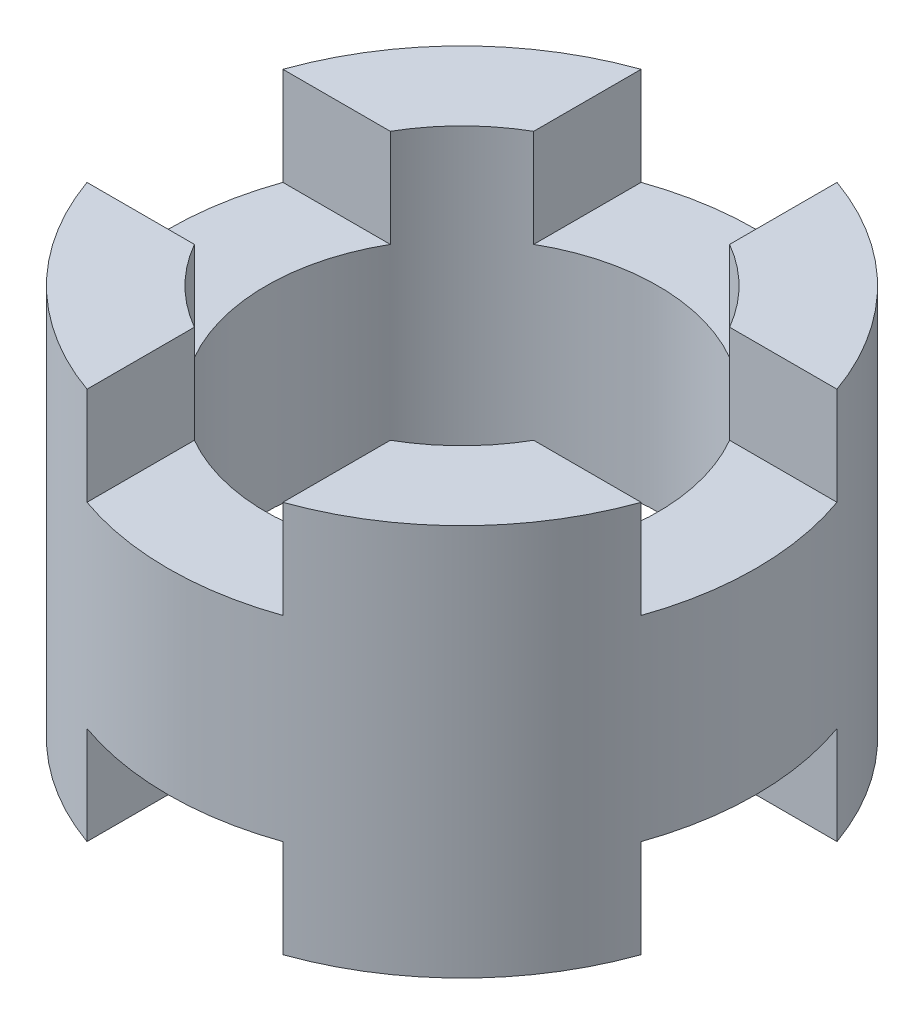
ISO-10303-21;
HEADER;
FILE_DESCRIPTION(('STEP AP214'),'2;1');
FILE_NAME('part.step','',(''),(''),'','','');
FILE_SCHEMA(('AUTOMOTIVE_DESIGN { 1 0 10303 214 1 1 1 1 }'));
ENDSEC;
DATA;
#1=APPLICATION_CONTEXT('core data for automotive mechanical design processes');
#2=APPLICATION_PROTOCOL_DEFINITION('international standard','automotive_design',2000,#1);
#3=PRODUCT_CONTEXT('',#1,'mechanical');
#4=PRODUCT('Part','Part','',(#3));
#5=PRODUCT_RELATED_PRODUCT_CATEGORY('part','',(#4));
#6=PRODUCT_DEFINITION_FORMATION('','',#4);
#7=PRODUCT_DEFINITION_CONTEXT('part definition',#1,'design');
#8=PRODUCT_DEFINITION('design','',#6,#7);
#9=PRODUCT_DEFINITION_SHAPE('','',#8);
#10=(LENGTH_UNIT() NAMED_UNIT(*) SI_UNIT(.MILLI.,.METRE.));
#11=(NAMED_UNIT(*) PLANE_ANGLE_UNIT() SI_UNIT($,.RADIAN.));
#12=(NAMED_UNIT(*) SI_UNIT($,.STERADIAN.) SOLID_ANGLE_UNIT());
#13=UNCERTAINTY_MEASURE_WITH_UNIT(LENGTH_MEASURE(1.E-05),#10,'distance_accuracy_value','');
#14=(GEOMETRIC_REPRESENTATION_CONTEXT(3) GLOBAL_UNCERTAINTY_ASSIGNED_CONTEXT((#13)) GLOBAL_UNIT_ASSIGNED_CONTEXT((#10,
#11,#12)) REPRESENTATION_CONTEXT('',''));
#15=CARTESIAN_POINT('',(0.,0.,0.));
#16=DIRECTION('',(0.,0.,1.));
#17=DIRECTION('',(1.,0.,0.));
#18=AXIS2_PLACEMENT_3D('',#15,#16,#17);
#19=CARTESIAN_POINT('',(0.,0.,0.));
#20=DIRECTION('',(0.,1.,0.));
#21=DIRECTION('',(0.,0.,1.));
#22=AXIS2_PLACEMENT_3D('',#19,#20,#21);
#23=PLANE('',#22);
#24=DIRECTION('',(0.,0.,-1.));
#25=VECTOR('',#24,1.);
#26=CARTESIAN_POINT('',(6.35000000000011,0.,39.1980233855296));
#27=LINE('',#26,#25);
#28=CARTESIAN_POINT('',(6.35000000000004,0.,17.9605122421383));
#29=VERTEX_POINT('',#28);
#30=CARTESIAN_POINT('',(6.35000000000002,0.,10.9985226280624));
#31=VERTEX_POINT('',#30);
#32=EDGE_CURVE('E269',#29,#31,#27,.T.);
#33=ORIENTED_EDGE('',*,*,#32,.T.);
#34=CARTESIAN_POINT('',(0.,0.,0.));
#35=DIRECTION('',(0.,1.,0.));
#36=DIRECTION('',(0.,0.,1.));
#37=AXIS2_PLACEMENT_3D('',#34,#35,#36);
#38=CIRCLE('',#37,12.7);
#39=CARTESIAN_POINT('',(10.9985226280624,0.,6.34999999999999));
#40=VERTEX_POINT('',#39);
#41=EDGE_CURVE('E489',#31,#40,#38,.T.);
#42=ORIENTED_EDGE('',*,*,#41,.T.);
#43=DIRECTION('',(1.,0.,0.));
#44=VECTOR('',#43,1.);
#45=CARTESIAN_POINT('',(-39.1980233855296,0.,6.34999999999998));
#46=LINE('',#45,#44);
#47=CARTESIAN_POINT('',(17.9605122421383,0.,6.34999999999999));
#48=VERTEX_POINT('',#47);
#49=EDGE_CURVE('E413',#40,#48,#46,.T.);
#50=ORIENTED_EDGE('',*,*,#49,.T.);
#51=CARTESIAN_POINT('',(0.,0.,0.));
#52=DIRECTION('',(0.,1.,0.));
#53=DIRECTION('',(0.,0.,1.));
#54=AXIS2_PLACEMENT_3D('',#51,#52,#53);
#55=CIRCLE('',#54,19.05);
#56=EDGE_CURVE('E276',#29,#48,#55,.T.);
#57=ORIENTED_EDGE('',*,*,#56,.F.);
#58=EDGE_LOOP('',(#33,#42,#50,#57));
#59=FACE_BOUND('',#58,.T.);
#60=ADVANCED_FACE('F41',(#59),#23,.F.);
#61=CARTESIAN_POINT('',(0.,25.4,0.));
#62=DIRECTION('',(0.,-1.,0.));
#63=DIRECTION('',(0.,0.,-1.));
#64=AXIS2_PLACEMENT_3D('',#61,#62,#63);
#65=CYLINDRICAL_SURFACE('',#64,19.05);
#66=CARTESIAN_POINT('',(0.,19.05,0.));
#67=DIRECTION('',(0.,-1.,0.));
#68=DIRECTION('',(0.,0.,-1.));
#69=AXIS2_PLACEMENT_3D('',#66,#67,#68);
#70=CIRCLE('',#69,19.05);
#71=CARTESIAN_POINT('',(6.35000000000007,19.05,17.9605122421383));
#72=VERTEX_POINT('',#71);
#73=CARTESIAN_POINT('',(-6.34999999999993,19.05,17.9605122421383));
#74=VERTEX_POINT('',#73);
#75=EDGE_CURVE('E448',#72,#74,#70,.T.);
#76=ORIENTED_EDGE('',*,*,#75,.T.);
#77=DIRECTION('',(0.,-1.,0.));
#78=VECTOR('',#77,1.);
#79=CARTESIAN_POINT('',(-6.34999999999993,25.4,17.9605122421383));
#80=LINE('',#79,#78);
#81=CARTESIAN_POINT('',(-6.34999999999993,25.4,17.9605122421383));
#82=VERTEX_POINT('',#81);
#83=EDGE_CURVE('E455',#74,#82,#80,.F.);
#84=ORIENTED_EDGE('',*,*,#83,.T.);
#85=CARTESIAN_POINT('',(0.,25.4,0.));
#86=DIRECTION('',(0.,1.,0.));
#87=DIRECTION('',(0.,0.,1.));
#88=AXIS2_PLACEMENT_3D('',#85,#86,#87);
#89=CIRCLE('',#88,19.05);
#90=CARTESIAN_POINT('',(-17.9605122421383,25.4,6.35000000000001));
#91=VERTEX_POINT('',#90);
#92=EDGE_CURVE('E287',#91,#82,#89,.T.);
#93=ORIENTED_EDGE('',*,*,#92,.F.);
#94=DIRECTION('',(0.,-1.,0.));
#95=VECTOR('',#94,1.);
#96=CARTESIAN_POINT('',(-17.9605122421383,25.4,6.35000000000001));
#97=LINE('',#96,#95);
#98=CARTESIAN_POINT('',(-17.9605122421383,19.05,6.35000000000001));
#99=VERTEX_POINT('',#98);
#100=EDGE_CURVE('E480',#91,#99,#97,.T.);
#101=ORIENTED_EDGE('',*,*,#100,.T.);
#102=CARTESIAN_POINT('',(0.,19.05,0.));
#103=DIRECTION('',(0.,-1.,0.));
#104=DIRECTION('',(0.,0.,-1.));
#105=AXIS2_PLACEMENT_3D('',#102,#103,#104);
#106=CIRCLE('',#105,19.05);
#107=CARTESIAN_POINT('',(-17.9605122421383,19.05,-6.34999999999999));
#108=VERTEX_POINT('',#107);
#109=EDGE_CURVE('E473',#99,#108,#106,.T.);
#110=ORIENTED_EDGE('',*,*,#109,.T.);
#111=DIRECTION('',(0.,-1.,0.));
#112=VECTOR('',#111,1.);
#113=CARTESIAN_POINT('',(-17.9605122421383,25.4,-6.34999999999999));
#114=LINE('',#113,#112);
#115=CARTESIAN_POINT('',(-17.9605122421383,25.4,-6.34999999999999));
#116=VERTEX_POINT('',#115);
#117=EDGE_CURVE('E483',#108,#116,#114,.F.);
#118=ORIENTED_EDGE('',*,*,#117,.T.);
#119=CARTESIAN_POINT('',(-6.35000000000006,25.4,-17.9605122421383));
#120=VERTEX_POINT('',#119);
#121=EDGE_CURVE('E288',#120,#116,#89,.T.);
#122=ORIENTED_EDGE('',*,*,#121,.F.);
#123=DIRECTION('',(0.,-1.,0.));
#124=VECTOR('',#123,1.);
#125=CARTESIAN_POINT('',(-6.35000000000006,25.4,-17.9605122421383));
#126=LINE('',#125,#124);
#127=CARTESIAN_POINT('',(-6.35000000000006,19.05,-17.9605122421383));
#128=VERTEX_POINT('',#127);
#129=EDGE_CURVE('E458',#120,#128,#126,.T.);
#130=ORIENTED_EDGE('',*,*,#129,.T.);
#131=CARTESIAN_POINT('',(6.34999999999994,19.05,-17.9605122421383));
#132=VERTEX_POINT('',#131);
#133=EDGE_CURVE('E445',#128,#132,#70,.T.);
#134=ORIENTED_EDGE('',*,*,#133,.T.);
#135=DIRECTION('',(0.,-1.,0.));
#136=VECTOR('',#135,1.);
#137=CARTESIAN_POINT('',(6.34999999999994,25.4,-17.9605122421383));
#138=LINE('',#137,#136);
#139=CARTESIAN_POINT('',(6.34999999999994,25.4,-17.9605122421383));
#140=VERTEX_POINT('',#139);
#141=EDGE_CURVE('E449',#132,#140,#138,.F.);
#142=ORIENTED_EDGE('',*,*,#141,.T.);
#143=CARTESIAN_POINT('',(17.9605122421383,25.4,-6.35));
#144=VERTEX_POINT('',#143);
#145=EDGE_CURVE('E295',#144,#140,#89,.T.);
#146=ORIENTED_EDGE('',*,*,#145,.F.);
#147=DIRECTION('',(0.,-1.,0.));
#148=VECTOR('',#147,1.);
#149=CARTESIAN_POINT('',(17.9605122421383,25.4,-6.35));
#150=LINE('',#149,#148);
#151=CARTESIAN_POINT('',(17.9605122421383,19.05,-6.35));
#152=VERTEX_POINT('',#151);
#153=EDGE_CURVE('E486',#144,#152,#150,.T.);
#154=ORIENTED_EDGE('',*,*,#153,.T.);
#155=CARTESIAN_POINT('',(17.9605122421383,19.05,6.35));
#156=VERTEX_POINT('',#155);
#157=EDGE_CURVE('E476',#152,#156,#106,.T.);
#158=ORIENTED_EDGE('',*,*,#157,.T.);
#159=DIRECTION('',(0.,-1.,0.));
#160=VECTOR('',#159,1.);
#161=CARTESIAN_POINT('',(17.9605122421383,25.4,6.35));
#162=LINE('',#161,#160);
#163=CARTESIAN_POINT('',(17.9605122421383,25.4,6.35));
#164=VERTEX_POINT('',#163);
#165=EDGE_CURVE('E477',#156,#164,#162,.F.);
#166=ORIENTED_EDGE('',*,*,#165,.T.);
#167=CARTESIAN_POINT('',(6.35000000000007,25.4,17.9605122421383));
#168=VERTEX_POINT('',#167);
#169=EDGE_CURVE('E283',#168,#164,#89,.T.);
#170=ORIENTED_EDGE('',*,*,#169,.F.);
#171=DIRECTION('',(0.,-1.,0.));
#172=VECTOR('',#171,1.);
#173=CARTESIAN_POINT('',(6.35000000000007,25.4,17.9605122421383));
#174=LINE('',#173,#172);
#175=EDGE_CURVE('E452',#168,#72,#174,.T.);
#176=ORIENTED_EDGE('',*,*,#175,.T.);
#177=EDGE_LOOP('',(#76,#84,#93,#101,#110,#118,#122,#130,#134,#142,#146,#154,#158,#166,#170,#176));
#178=FACE_BOUND('',#177,.T.);
#179=DIRECTION('',(0.,-1.,0.));
#180=VECTOR('',#179,1.);
#181=CARTESIAN_POINT('',(6.35000000000004,25.4,17.9605122421383));
#182=LINE('',#181,#180);
#183=CARTESIAN_POINT('',(6.35000000000004,6.35,17.9605122421383));
#184=VERTEX_POINT('',#183);
#185=EDGE_CURVE('E397',#29,#184,#182,.F.);
#186=ORIENTED_EDGE('',*,*,#185,.F.);
#187=ORIENTED_EDGE('',*,*,#56,.T.);
#188=DIRECTION('',(0.,-1.,0.));
#189=VECTOR('',#188,1.);
#190=CARTESIAN_POINT('',(17.9605122421383,25.4,6.34999999999999));
#191=LINE('',#190,#189);
#192=CARTESIAN_POINT('',(17.9605122421383,6.35,6.34999999999999));
#193=VERTEX_POINT('',#192);
#194=EDGE_CURVE('E428',#193,#48,#191,.T.);
#195=ORIENTED_EDGE('',*,*,#194,.F.);
#196=CARTESIAN_POINT('',(0.,6.35,0.));
#197=DIRECTION('',(0.,-1.,0.));
#198=DIRECTION('',(0.,0.,-1.));
#199=AXIS2_PLACEMENT_3D('',#196,#197,#198);
#200=CIRCLE('',#199,19.05);
#201=CARTESIAN_POINT('',(17.9605122421383,6.35,-6.35000000000001));
#202=VERTEX_POINT('',#201);
#203=EDGE_CURVE('E421',#202,#193,#200,.T.);
#204=ORIENTED_EDGE('',*,*,#203,.F.);
#205=DIRECTION('',(0.,-1.,0.));
#206=VECTOR('',#205,1.);
#207=CARTESIAN_POINT('',(17.9605122421383,25.4,-6.35000000000001));
#208=LINE('',#207,#206);
#209=CARTESIAN_POINT('',(17.9605122421383,0.,-6.35000000000001));
#210=VERTEX_POINT('',#209);
#211=EDGE_CURVE('E425',#202,#210,#208,.T.);
#212=ORIENTED_EDGE('',*,*,#211,.T.);
#213=CARTESIAN_POINT('',(6.34999999999993,0.,-17.9605122421383));
#214=VERTEX_POINT('',#213);
#215=EDGE_CURVE('E278',#210,#214,#55,.T.);
#216=ORIENTED_EDGE('',*,*,#215,.T.);
#217=DIRECTION('',(0.,-1.,0.));
#218=VECTOR('',#217,1.);
#219=CARTESIAN_POINT('',(6.34999999999993,25.4,-17.9605122421383));
#220=LINE('',#219,#218);
#221=CARTESIAN_POINT('',(6.34999999999993,6.35,-17.9605122421383));
#222=VERTEX_POINT('',#221);
#223=EDGE_CURVE('E399',#222,#214,#220,.T.);
#224=ORIENTED_EDGE('',*,*,#223,.F.);
#225=CARTESIAN_POINT('',(0.,6.35,0.));
#226=DIRECTION('',(0.,-1.,0.));
#227=DIRECTION('',(0.,0.,-1.));
#228=AXIS2_PLACEMENT_3D('',#225,#226,#227);
#229=CIRCLE('',#228,19.05);
#230=CARTESIAN_POINT('',(-6.35000000000007,6.35,-17.9605122421383));
#231=VERTEX_POINT('',#230);
#232=EDGE_CURVE('E401',#231,#222,#229,.T.);
#233=ORIENTED_EDGE('',*,*,#232,.F.);
#234=DIRECTION('',(0.,-1.,0.));
#235=VECTOR('',#234,1.);
#236=CARTESIAN_POINT('',(-6.35000000000007,25.4,-17.9605122421383));
#237=LINE('',#236,#235);
#238=CARTESIAN_POINT('',(-6.35000000000007,0.,-17.9605122421383));
#239=VERTEX_POINT('',#238);
#240=EDGE_CURVE('E258',#231,#239,#237,.T.);
#241=ORIENTED_EDGE('',*,*,#240,.T.);
#242=CARTESIAN_POINT('',(-17.9605122421383,0.,-6.35000000000002));
#243=VERTEX_POINT('',#242);
#244=EDGE_CURVE('E275',#239,#243,#55,.T.);
#245=ORIENTED_EDGE('',*,*,#244,.T.);
#246=DIRECTION('',(0.,-1.,0.));
#247=VECTOR('',#246,1.);
#248=CARTESIAN_POINT('',(-17.9605122421383,25.4,-6.35000000000002));
#249=LINE('',#248,#247);
#250=CARTESIAN_POINT('',(-17.9605122421383,6.35,-6.35000000000002));
#251=VERTEX_POINT('',#250);
#252=EDGE_CURVE('E422',#243,#251,#249,.F.);
#253=ORIENTED_EDGE('',*,*,#252,.T.);
#254=CARTESIAN_POINT('',(-17.9605122421383,6.35,6.34999999999998));
#255=VERTEX_POINT('',#254);
#256=EDGE_CURVE('E419',#255,#251,#200,.T.);
#257=ORIENTED_EDGE('',*,*,#256,.F.);
#258=DIRECTION('',(0.,-1.,0.));
#259=VECTOR('',#258,1.);
#260=CARTESIAN_POINT('',(-17.9605122421383,25.4,6.34999999999998));
#261=LINE('',#260,#259);
#262=CARTESIAN_POINT('',(-17.9605122421383,0.,6.34999999999998));
#263=VERTEX_POINT('',#262);
#264=EDGE_CURVE('E274',#263,#255,#261,.F.);
#265=ORIENTED_EDGE('',*,*,#264,.F.);
#266=CARTESIAN_POINT('',(-6.34999999999995,0.,17.9605122421383));
#267=VERTEX_POINT('',#266);
#268=EDGE_CURVE('E265',#263,#267,#55,.T.);
#269=ORIENTED_EDGE('',*,*,#268,.T.);
#270=DIRECTION('',(0.,-1.,0.));
#271=VECTOR('',#270,1.);
#272=CARTESIAN_POINT('',(-6.34999999999995,25.4,17.9605122421383));
#273=LINE('',#272,#271);
#274=CARTESIAN_POINT('',(-6.34999999999995,6.35,17.9605122421383));
#275=VERTEX_POINT('',#274);
#276=EDGE_CURVE('E250',#267,#275,#273,.F.);
#277=ORIENTED_EDGE('',*,*,#276,.T.);
#278=EDGE_CURVE('E403',#184,#275,#229,.T.);
#279=ORIENTED_EDGE('',*,*,#278,.F.);
#280=EDGE_LOOP('',(#186,#187,#195,#204,#212,#216,#224,#233,#241,#245,#253,#257,#265,#269,#277,#279));
#281=FACE_BOUND('',#280,.T.);
#282=ADVANCED_FACE('F43',(#178,#281),#65,.T.);
#283=CARTESIAN_POINT('',(0.,25.4,0.));
#284=DIRECTION('',(0.,-1.,0.));
#285=DIRECTION('',(0.,0.,-1.));
#286=AXIS2_PLACEMENT_3D('',#283,#284,#285);
#287=CYLINDRICAL_SURFACE('',#286,12.7);
#288=DIRECTION('',(0.,-1.,0.));
#289=VECTOR('',#288,1.);
#290=CARTESIAN_POINT('',(-6.34999999999995,25.4,10.9985226280624));
#291=LINE('',#290,#289);
#292=CARTESIAN_POINT('',(-6.34999999999995,19.05,10.9985226280624));
#293=VERTEX_POINT('',#292);
#294=CARTESIAN_POINT('',(-6.34999999999995,25.4,10.9985226280624));
#295=VERTEX_POINT('',#294);
#296=EDGE_CURVE('E343',#293,#295,#291,.F.);
#297=ORIENTED_EDGE('',*,*,#296,.F.);
#298=CARTESIAN_POINT('',(0.,19.05,0.));
#299=DIRECTION('',(0.,-1.,0.));
#300=DIRECTION('',(0.,0.,-1.));
#301=AXIS2_PLACEMENT_3D('',#298,#299,#300);
#302=CIRCLE('',#301,12.7);
#303=CARTESIAN_POINT('',(6.35000000000005,19.05,10.9985226280623));
#304=VERTEX_POINT('',#303);
#305=EDGE_CURVE('E335',#304,#293,#302,.T.);
#306=ORIENTED_EDGE('',*,*,#305,.F.);
#307=DIRECTION('',(0.,-1.,0.));
#308=VECTOR('',#307,1.);
#309=CARTESIAN_POINT('',(6.35000000000005,25.4,10.9985226280623));
#310=LINE('',#309,#308);
#311=CARTESIAN_POINT('',(6.35000000000005,25.4,10.9985226280623));
#312=VERTEX_POINT('',#311);
#313=EDGE_CURVE('E340',#312,#304,#310,.T.);
#314=ORIENTED_EDGE('',*,*,#313,.F.);
#315=CARTESIAN_POINT('',(0.,25.4,0.));
#316=DIRECTION('',(0.,1.,0.));
#317=DIRECTION('',(0.,0.,1.));
#318=AXIS2_PLACEMENT_3D('',#315,#316,#317);
#319=CIRCLE('',#318,12.7);
#320=CARTESIAN_POINT('',(10.9985226280624,25.4,6.35));
#321=VERTEX_POINT('',#320);
#322=EDGE_CURVE('E493',#312,#321,#319,.T.);
#323=ORIENTED_EDGE('',*,*,#322,.T.);
#324=DIRECTION('',(0.,-1.,0.));
#325=VECTOR('',#324,1.);
#326=CARTESIAN_POINT('',(10.9985226280624,25.4,6.35));
#327=LINE('',#326,#325);
#328=CARTESIAN_POINT('',(10.9985226280624,19.05,6.35));
#329=VERTEX_POINT('',#328);
#330=EDGE_CURVE('E317',#329,#321,#327,.F.);
#331=ORIENTED_EDGE('',*,*,#330,.F.);
#332=CARTESIAN_POINT('',(0.,19.05,0.));
#333=DIRECTION('',(0.,-1.,0.));
#334=DIRECTION('',(0.,0.,-1.));
#335=AXIS2_PLACEMENT_3D('',#332,#333,#334);
#336=CIRCLE('',#335,12.7);
#337=CARTESIAN_POINT('',(10.9985226280624,19.05,-6.35));
#338=VERTEX_POINT('',#337);
#339=EDGE_CURVE('E309',#338,#329,#336,.T.);
#340=ORIENTED_EDGE('',*,*,#339,.F.);
#341=DIRECTION('',(0.,-1.,0.));
#342=VECTOR('',#341,1.);
#343=CARTESIAN_POINT('',(10.9985226280624,25.4,-6.35));
#344=LINE('',#343,#342);
#345=CARTESIAN_POINT('',(10.9985226280624,25.4,-6.35));
#346=VERTEX_POINT('',#345);
#347=EDGE_CURVE('E323',#346,#338,#344,.T.);
#348=ORIENTED_EDGE('',*,*,#347,.F.);
#349=CARTESIAN_POINT('',(6.34999999999996,25.4,-10.9985226280624));
#350=VERTEX_POINT('',#349);
#351=EDGE_CURVE('E279',#346,#350,#319,.T.);
#352=ORIENTED_EDGE('',*,*,#351,.T.);
#353=DIRECTION('',(0.,-1.,0.));
#354=VECTOR('',#353,1.);
#355=CARTESIAN_POINT('',(6.34999999999996,25.4,-10.9985226280624));
#356=LINE('',#355,#354);
#357=CARTESIAN_POINT('',(6.34999999999996,19.05,-10.9985226280624));
#358=VERTEX_POINT('',#357);
#359=EDGE_CURVE('E334',#358,#350,#356,.F.);
#360=ORIENTED_EDGE('',*,*,#359,.F.);
#361=CARTESIAN_POINT('',(-6.35000000000004,19.05,-10.9985226280624));
#362=VERTEX_POINT('',#361);
#363=EDGE_CURVE('E332',#362,#358,#302,.T.);
#364=ORIENTED_EDGE('',*,*,#363,.F.);
#365=DIRECTION('',(0.,-1.,0.));
#366=VECTOR('',#365,1.);
#367=CARTESIAN_POINT('',(-6.35000000000004,25.4,-10.9985226280624));
#368=LINE('',#367,#366);
#369=CARTESIAN_POINT('',(-6.35000000000004,25.4,-10.9985226280624));
#370=VERTEX_POINT('',#369);
#371=EDGE_CURVE('E337',#370,#362,#368,.T.);
#372=ORIENTED_EDGE('',*,*,#371,.F.);
#373=CARTESIAN_POINT('',(-10.9985226280624,25.4,-6.34999999999999));
#374=VERTEX_POINT('',#373);
#375=EDGE_CURVE('E492',#370,#374,#319,.T.);
#376=ORIENTED_EDGE('',*,*,#375,.T.);
#377=DIRECTION('',(0.,-1.,0.));
#378=VECTOR('',#377,1.);
#379=CARTESIAN_POINT('',(-10.9985226280624,25.4,-6.34999999999999));
#380=LINE('',#379,#378);
#381=CARTESIAN_POINT('',(-10.9985226280624,19.05,-6.34999999999999));
#382=VERTEX_POINT('',#381);
#383=EDGE_CURVE('E315',#382,#374,#380,.F.);
#384=ORIENTED_EDGE('',*,*,#383,.F.);
#385=CARTESIAN_POINT('',(-10.9985226280624,19.05,6.35000000000001));
#386=VERTEX_POINT('',#385);
#387=EDGE_CURVE('E303',#386,#382,#336,.T.);
#388=ORIENTED_EDGE('',*,*,#387,.F.);
#389=DIRECTION('',(0.,-1.,0.));
#390=VECTOR('',#389,1.);
#391=CARTESIAN_POINT('',(-10.9985226280624,25.4,6.35000000000001));
#392=LINE('',#391,#390);
#393=CARTESIAN_POINT('',(-10.9985226280624,25.4,6.35000000000001));
#394=VERTEX_POINT('',#393);
#395=EDGE_CURVE('E308',#394,#386,#392,.T.);
#396=ORIENTED_EDGE('',*,*,#395,.F.);
#397=EDGE_CURVE('E490',#394,#295,#319,.T.);
#398=ORIENTED_EDGE('',*,*,#397,.T.);
#399=EDGE_LOOP('',(#297,#306,#314,#323,#331,#340,#348,#352,#360,#364,#372,#376,#384,#388,#396,#398));
#400=FACE_BOUND('',#399,.T.);
#401=ORIENTED_EDGE('',*,*,#41,.F.);
#402=DIRECTION('',(0.,-1.,0.));
#403=VECTOR('',#402,1.);
#404=CARTESIAN_POINT('',(6.35000000000002,25.4,10.9985226280624));
#405=LINE('',#404,#403);
#406=CARTESIAN_POINT('',(6.35000000000002,6.35,10.9985226280624));
#407=VERTEX_POINT('',#406);
#408=EDGE_CURVE('E393',#31,#407,#405,.F.);
#409=ORIENTED_EDGE('',*,*,#408,.T.);
#410=CARTESIAN_POINT('',(0.,6.35,0.));
#411=DIRECTION('',(0.,-1.,0.));
#412=DIRECTION('',(0.,0.,-1.));
#413=AXIS2_PLACEMENT_3D('',#410,#411,#412);
#414=CIRCLE('',#413,12.7);
#415=CARTESIAN_POINT('',(-6.34999999999998,6.35,10.9985226280624));
#416=VERTEX_POINT('',#415);
#417=EDGE_CURVE('E12',#407,#416,#414,.T.);
#418=ORIENTED_EDGE('',*,*,#417,.T.);
#419=DIRECTION('',(0.,-1.,0.));
#420=VECTOR('',#419,1.);
#421=CARTESIAN_POINT('',(-6.34999999999998,25.4,10.9985226280624));
#422=LINE('',#421,#420);
#423=CARTESIAN_POINT('',(-6.34999999999998,0.,10.9985226280624));
#424=VERTEX_POINT('',#423);
#425=EDGE_CURVE('E384',#424,#416,#422,.F.);
#426=ORIENTED_EDGE('',*,*,#425,.F.);
#427=CARTESIAN_POINT('',(-10.9985226280624,0.,6.34999999999998));
#428=VERTEX_POINT('',#427);
#429=EDGE_CURVE('E267',#428,#424,#38,.T.);
#430=ORIENTED_EDGE('',*,*,#429,.F.);
#431=DIRECTION('',(0.,-1.,0.));
#432=VECTOR('',#431,1.);
#433=CARTESIAN_POINT('',(-10.9985226280624,25.4,6.34999999999998));
#434=LINE('',#433,#432);
#435=CARTESIAN_POINT('',(-10.9985226280624,6.35,6.34999999999998));
#436=VERTEX_POINT('',#435);
#437=EDGE_CURVE('E352',#428,#436,#434,.F.);
#438=ORIENTED_EDGE('',*,*,#437,.T.);
#439=CARTESIAN_POINT('',(0.,6.35,0.));
#440=DIRECTION('',(0.,-1.,0.));
#441=DIRECTION('',(0.,0.,-1.));
#442=AXIS2_PLACEMENT_3D('',#439,#440,#441);
#443=CIRCLE('',#442,12.7);
#444=CARTESIAN_POINT('',(-10.9985226280624,6.35,-6.35000000000002));
#445=VERTEX_POINT('',#444);
#446=EDGE_CURVE('E345',#436,#445,#443,.T.);
#447=ORIENTED_EDGE('',*,*,#446,.T.);
#448=DIRECTION('',(0.,-1.,0.));
#449=VECTOR('',#448,1.);
#450=CARTESIAN_POINT('',(-10.9985226280624,25.4,-6.35000000000002));
#451=LINE('',#450,#449);
#452=CARTESIAN_POINT('',(-10.9985226280624,0.,-6.35000000000002));
#453=VERTEX_POINT('',#452);
#454=EDGE_CURVE('E348',#453,#445,#451,.F.);
#455=ORIENTED_EDGE('',*,*,#454,.F.);
#456=CARTESIAN_POINT('',(-6.35000000000005,0.,-10.9985226280623));
#457=VERTEX_POINT('',#456);
#458=EDGE_CURVE('E494',#457,#453,#38,.T.);
#459=ORIENTED_EDGE('',*,*,#458,.F.);
#460=DIRECTION('',(0.,-1.,0.));
#461=VECTOR('',#460,1.);
#462=CARTESIAN_POINT('',(-6.35000000000005,25.4,-10.9985226280623));
#463=LINE('',#462,#461);
#464=CARTESIAN_POINT('',(-6.35000000000005,6.35,-10.9985226280623));
#465=VERTEX_POINT('',#464);
#466=EDGE_CURVE('E64',#465,#457,#463,.T.);
#467=ORIENTED_EDGE('',*,*,#466,.F.);
#468=CARTESIAN_POINT('',(6.34999999999995,6.35,-10.9985226280624));
#469=VERTEX_POINT('',#468);
#470=EDGE_CURVE('E45',#465,#469,#414,.T.);
#471=ORIENTED_EDGE('',*,*,#470,.T.);
#472=DIRECTION('',(0.,-1.,0.));
#473=VECTOR('',#472,1.);
#474=CARTESIAN_POINT('',(6.34999999999995,25.4,-10.9985226280624));
#475=LINE('',#474,#473);
#476=CARTESIAN_POINT('',(6.34999999999995,0.,-10.9985226280624));
#477=VERTEX_POINT('',#476);
#478=EDGE_CURVE('E370',#469,#477,#475,.T.);
#479=ORIENTED_EDGE('',*,*,#478,.T.);
#480=CARTESIAN_POINT('',(10.9985226280624,0.,-6.35000000000001));
#481=VERTEX_POINT('',#480);
#482=EDGE_CURVE('E495',#481,#477,#38,.T.);
#483=ORIENTED_EDGE('',*,*,#482,.F.);
#484=DIRECTION('',(0.,-1.,0.));
#485=VECTOR('',#484,1.);
#486=CARTESIAN_POINT('',(10.9985226280624,25.4,-6.35000000000001));
#487=LINE('',#486,#485);
#488=CARTESIAN_POINT('',(10.9985226280624,6.35,-6.35000000000001));
#489=VERTEX_POINT('',#488);
#490=EDGE_CURVE('E355',#489,#481,#487,.T.);
#491=ORIENTED_EDGE('',*,*,#490,.F.);
#492=CARTESIAN_POINT('',(10.9985226280624,6.35,6.34999999999999));
#493=VERTEX_POINT('',#492);
#494=EDGE_CURVE('E349',#489,#493,#443,.T.);
#495=ORIENTED_EDGE('',*,*,#494,.T.);
#496=DIRECTION('',(0.,-1.,0.));
#497=VECTOR('',#496,1.);
#498=CARTESIAN_POINT('',(10.9985226280624,25.4,6.34999999999999));
#499=LINE('',#498,#497);
#500=EDGE_CURVE('E357',#493,#40,#499,.T.);
#501=ORIENTED_EDGE('',*,*,#500,.T.);
#502=EDGE_LOOP('',(#401,#409,#418,#426,#430,#438,#447,#455,#459,#467,#471,#479,#483,#491,#495,#501));
#503=FACE_BOUND('',#502,.T.);
#504=ADVANCED_FACE('F368',(#400,#503),#287,.F.);
#505=DIRECTION('',(0.,0.,1.));
#506=VECTOR('',#505,1.);
#507=CARTESIAN_POINT('',(6.34999999999999,0.,0.));
#508=LINE('',#507,#506);
#509=EDGE_CURVE('E361',#214,#477,#508,.T.);
#510=ORIENTED_EDGE('',*,*,#509,.F.);
#511=ORIENTED_EDGE('',*,*,#215,.F.);
#512=DIRECTION('',(1.,0.,0.));
#513=VECTOR('',#512,1.);
#514=CARTESIAN_POINT('',(-39.1980233855296,0.,-6.35000000000002));
#515=LINE('',#514,#513);
#516=EDGE_CURVE('E417',#481,#210,#515,.T.);
#517=ORIENTED_EDGE('',*,*,#516,.F.);
#518=ORIENTED_EDGE('',*,*,#482,.T.);
#519=EDGE_LOOP('',(#510,#511,#517,#518));
#520=FACE_BOUND('',#519,.T.);
#521=ADVANCED_FACE('F561',(#520),#23,.F.);
#522=ORIENTED_EDGE('',*,*,#429,.T.);
#523=DIRECTION('',(0.,0.,-1.));
#524=VECTOR('',#523,1.);
#525=CARTESIAN_POINT('',(-6.34999999999989,0.,39.1980233855296));
#526=LINE('',#525,#524);
#527=EDGE_CURVE('E253',#267,#424,#526,.T.);
#528=ORIENTED_EDGE('',*,*,#527,.F.);
#529=ORIENTED_EDGE('',*,*,#268,.F.);
#530=EDGE_CURVE('E416',#263,#428,#46,.T.);
#531=ORIENTED_EDGE('',*,*,#530,.T.);
#532=EDGE_LOOP('',(#522,#528,#529,#531));
#533=FACE_BOUND('',#532,.T.);
#534=ADVANCED_FACE('F263',(#533),#23,.F.);
#535=CARTESIAN_POINT('',(0.,25.4,0.));
#536=DIRECTION('',(0.,1.,0.));
#537=DIRECTION('',(0.,0.,1.));
#538=AXIS2_PLACEMENT_3D('',#535,#536,#537);
#539=PLANE('',#538);
#540=DIRECTION('',(0.,0.,1.));
#541=VECTOR('',#540,1.);
#542=CARTESIAN_POINT('',(-6.35000000000013,25.4,-38.0999999999997));
#543=LINE('',#542,#541);
#544=EDGE_CURVE('E436',#120,#370,#543,.T.);
#545=ORIENTED_EDGE('',*,*,#544,.F.);
#546=ORIENTED_EDGE('',*,*,#121,.T.);
#547=DIRECTION('',(-1.,0.,0.));
#548=VECTOR('',#547,1.);
#549=CARTESIAN_POINT('',(38.0999999999997,25.4,-6.35));
#550=LINE('',#549,#548);
#551=EDGE_CURVE('E471',#374,#116,#550,.T.);
#552=ORIENTED_EDGE('',*,*,#551,.F.);
#553=ORIENTED_EDGE('',*,*,#375,.F.);
#554=EDGE_LOOP('',(#545,#546,#552,#553));
#555=FACE_BOUND('',#554,.T.);
#556=ADVANCED_FACE('F521',(#555),#539,.T.);
#557=EDGE_CURVE('E443',#295,#82,#543,.T.);
#558=ORIENTED_EDGE('',*,*,#557,.F.);
#559=ORIENTED_EDGE('',*,*,#397,.F.);
#560=DIRECTION('',(1.,0.,0.));
#561=VECTOR('',#560,1.);
#562=CARTESIAN_POINT('',(38.0999999999997,25.4,6.35));
#563=LINE('',#562,#561);
#564=EDGE_CURVE('E470',#91,#394,#563,.T.);
#565=ORIENTED_EDGE('',*,*,#564,.F.);
#566=ORIENTED_EDGE('',*,*,#92,.T.);
#567=EDGE_LOOP('',(#558,#559,#565,#566));
#568=FACE_BOUND('',#567,.T.);
#569=ADVANCED_FACE('F533',(#568),#539,.T.);
#570=DIRECTION('',(0.,0.,-1.));
#571=VECTOR('',#570,1.);
#572=CARTESIAN_POINT('',(6.34999999999987,25.4,-38.0999999999998));
#573=LINE('',#572,#571);
#574=EDGE_CURVE('E431',#350,#140,#573,.T.);
#575=ORIENTED_EDGE('',*,*,#574,.F.);
#576=ORIENTED_EDGE('',*,*,#351,.F.);
#577=EDGE_CURVE('E465',#144,#346,#550,.T.);
#578=ORIENTED_EDGE('',*,*,#577,.F.);
#579=ORIENTED_EDGE('',*,*,#145,.T.);
#580=EDGE_LOOP('',(#575,#576,#578,#579));
#581=FACE_BOUND('',#580,.T.);
#582=ADVANCED_FACE('F510',(#581),#539,.T.);
#583=EDGE_CURVE('E442',#168,#312,#573,.T.);
#584=ORIENTED_EDGE('',*,*,#583,.F.);
#585=ORIENTED_EDGE('',*,*,#169,.T.);
#586=EDGE_CURVE('E461',#321,#164,#563,.T.);
#587=ORIENTED_EDGE('',*,*,#586,.F.);
#588=ORIENTED_EDGE('',*,*,#322,.F.);
#589=EDGE_LOOP('',(#584,#585,#587,#588));
#590=FACE_BOUND('',#589,.T.);
#591=ADVANCED_FACE('F543',(#590),#539,.T.);
#592=ORIENTED_EDGE('',*,*,#244,.F.);
#593=DIRECTION('',(0.,0.,1.));
#594=VECTOR('',#593,1.);
#595=CARTESIAN_POINT('',(-6.35000000000001,0.,0.));
#596=LINE('',#595,#594);
#597=EDGE_CURVE('E360',#239,#457,#596,.T.);
#598=ORIENTED_EDGE('',*,*,#597,.T.);
#599=ORIENTED_EDGE('',*,*,#458,.T.);
#600=EDGE_CURVE('E408',#243,#453,#515,.T.);
#601=ORIENTED_EDGE('',*,*,#600,.F.);
#602=EDGE_LOOP('',(#592,#598,#599,#601));
#603=FACE_BOUND('',#602,.T.);
#604=ADVANCED_FACE('F562',(#603),#23,.F.);
#605=CARTESIAN_POINT('',(0.,19.05,0.));
#606=DIRECTION('',(0.,-1.,0.));
#607=DIRECTION('',(0.,0.,-1.));
#608=AXIS2_PLACEMENT_3D('',#605,#606,#607);
#609=PLANE('',#608);
#610=DIRECTION('',(1.,0.,0.));
#611=VECTOR('',#610,1.);
#612=CARTESIAN_POINT('',(38.0999999999997,19.05,6.35));
#613=LINE('',#612,#611);
#614=EDGE_CURVE('E464',#99,#386,#613,.T.);
#615=ORIENTED_EDGE('',*,*,#614,.T.);
#616=ORIENTED_EDGE('',*,*,#387,.T.);
#617=DIRECTION('',(-1.,0.,0.));
#618=VECTOR('',#617,1.);
#619=CARTESIAN_POINT('',(38.0999999999997,19.05,-6.35));
#620=LINE('',#619,#618);
#621=EDGE_CURVE('E466',#382,#108,#620,.T.);
#622=ORIENTED_EDGE('',*,*,#621,.T.);
#623=ORIENTED_EDGE('',*,*,#109,.F.);
#624=EDGE_LOOP('',(#615,#616,#622,#623));
#625=FACE_BOUND('',#624,.T.);
#626=ADVANCED_FACE('F525',(#625),#609,.F.);
#627=CARTESIAN_POINT('',(38.0999999999997,19.05,6.35));
#628=DIRECTION('',(0.,0.,1.));
#629=DIRECTION('',(1.,0.,0.));
#630=AXIS2_PLACEMENT_3D('',#627,#628,#629);
#631=PLANE('',#630);
#632=ORIENTED_EDGE('',*,*,#564,.T.);
#633=ORIENTED_EDGE('',*,*,#395,.T.);
#634=ORIENTED_EDGE('',*,*,#614,.F.);
#635=ORIENTED_EDGE('',*,*,#100,.F.);
#636=EDGE_LOOP('',(#632,#633,#634,#635));
#637=FACE_BOUND('',#636,.T.);
#638=ADVANCED_FACE('F527',(#637),#631,.F.);
#639=CARTESIAN_POINT('',(38.0999999999997,19.05,-6.35));
#640=DIRECTION('',(0.,0.,-1.));
#641=DIRECTION('',(-1.,0.,0.));
#642=AXIS2_PLACEMENT_3D('',#639,#640,#641);
#643=PLANE('',#642);
#644=ORIENTED_EDGE('',*,*,#621,.F.);
#645=ORIENTED_EDGE('',*,*,#383,.T.);
#646=ORIENTED_EDGE('',*,*,#551,.T.);
#647=ORIENTED_EDGE('',*,*,#117,.F.);
#648=EDGE_LOOP('',(#644,#645,#646,#647));
#649=FACE_BOUND('',#648,.T.);
#650=ADVANCED_FACE('F522',(#649),#643,.F.);
#651=ORIENTED_EDGE('',*,*,#577,.T.);
#652=ORIENTED_EDGE('',*,*,#347,.T.);
#653=EDGE_CURVE('E468',#152,#338,#620,.T.);
#654=ORIENTED_EDGE('',*,*,#653,.F.);
#655=ORIENTED_EDGE('',*,*,#153,.F.);
#656=EDGE_LOOP('',(#651,#652,#654,#655));
#657=FACE_BOUND('',#656,.T.);
#658=ADVANCED_FACE('F550',(#657),#643,.F.);
#659=EDGE_CURVE('E462',#329,#156,#613,.T.);
#660=ORIENTED_EDGE('',*,*,#659,.F.);
#661=ORIENTED_EDGE('',*,*,#330,.T.);
#662=ORIENTED_EDGE('',*,*,#586,.T.);
#663=ORIENTED_EDGE('',*,*,#165,.F.);
#664=EDGE_LOOP('',(#660,#661,#662,#663));
#665=FACE_BOUND('',#664,.T.);
#666=ADVANCED_FACE('F545',(#665),#631,.F.);
#667=ORIENTED_EDGE('',*,*,#653,.T.);
#668=ORIENTED_EDGE('',*,*,#339,.T.);
#669=ORIENTED_EDGE('',*,*,#659,.T.);
#670=ORIENTED_EDGE('',*,*,#157,.F.);
#671=EDGE_LOOP('',(#667,#668,#669,#670));
#672=FACE_BOUND('',#671,.T.);
#673=ADVANCED_FACE('F548',(#672),#609,.F.);
#674=CARTESIAN_POINT('',(0.,19.05,0.));
#675=DIRECTION('',(0.,-1.,0.));
#676=DIRECTION('',(-1.,0.,0.));
#677=AXIS2_PLACEMENT_3D('',#674,#675,#676);
#678=PLANE('',#677);
#679=DIRECTION('',(0.,0.,1.));
#680=VECTOR('',#679,1.);
#681=CARTESIAN_POINT('',(-6.35000000000013,19.05,-38.0999999999997));
#682=LINE('',#681,#680);
#683=EDGE_CURVE('E440',#128,#362,#682,.T.);
#684=ORIENTED_EDGE('',*,*,#683,.T.);
#685=ORIENTED_EDGE('',*,*,#363,.T.);
#686=DIRECTION('',(0.,0.,-1.));
#687=VECTOR('',#686,1.);
#688=CARTESIAN_POINT('',(6.34999999999987,19.05,-38.0999999999998));
#689=LINE('',#688,#687);
#690=EDGE_CURVE('E432',#358,#132,#689,.T.);
#691=ORIENTED_EDGE('',*,*,#690,.T.);
#692=ORIENTED_EDGE('',*,*,#133,.F.);
#693=EDGE_LOOP('',(#684,#685,#691,#692));
#694=FACE_BOUND('',#693,.T.);
#695=ADVANCED_FACE('F518',(#694),#678,.F.);
#696=CARTESIAN_POINT('',(6.34999999999987,19.05,-38.0999999999998));
#697=DIRECTION('',(1.,0.,0.));
#698=DIRECTION('',(0.,0.,-1.));
#699=AXIS2_PLACEMENT_3D('',#696,#697,#698);
#700=PLANE('',#699);
#701=ORIENTED_EDGE('',*,*,#690,.F.);
#702=ORIENTED_EDGE('',*,*,#359,.T.);
#703=ORIENTED_EDGE('',*,*,#574,.T.);
#704=ORIENTED_EDGE('',*,*,#141,.F.);
#705=EDGE_LOOP('',(#701,#702,#703,#704));
#706=FACE_BOUND('',#705,.T.);
#707=ADVANCED_FACE('F513',(#706),#700,.F.);
#708=CARTESIAN_POINT('',(-6.35000000000013,19.05,-38.0999999999997));
#709=DIRECTION('',(-1.,0.,0.));
#710=DIRECTION('',(0.,0.,1.));
#711=AXIS2_PLACEMENT_3D('',#708,#709,#710);
#712=PLANE('',#711);
#713=ORIENTED_EDGE('',*,*,#544,.T.);
#714=ORIENTED_EDGE('',*,*,#371,.T.);
#715=ORIENTED_EDGE('',*,*,#683,.F.);
#716=ORIENTED_EDGE('',*,*,#129,.F.);
#717=EDGE_LOOP('',(#713,#714,#715,#716));
#718=FACE_BOUND('',#717,.T.);
#719=ADVANCED_FACE('F520',(#718),#712,.F.);
#720=EDGE_CURVE('E437',#293,#74,#682,.T.);
#721=ORIENTED_EDGE('',*,*,#720,.F.);
#722=ORIENTED_EDGE('',*,*,#296,.T.);
#723=ORIENTED_EDGE('',*,*,#557,.T.);
#724=ORIENTED_EDGE('',*,*,#83,.F.);
#725=EDGE_LOOP('',(#721,#722,#723,#724));
#726=FACE_BOUND('',#725,.T.);
#727=ADVANCED_FACE('F536',(#726),#712,.F.);
#728=ORIENTED_EDGE('',*,*,#583,.T.);
#729=ORIENTED_EDGE('',*,*,#313,.T.);
#730=EDGE_CURVE('E435',#72,#304,#689,.T.);
#731=ORIENTED_EDGE('',*,*,#730,.F.);
#732=ORIENTED_EDGE('',*,*,#175,.F.);
#733=EDGE_LOOP('',(#728,#729,#731,#732));
#734=FACE_BOUND('',#733,.T.);
#735=ADVANCED_FACE('F541',(#734),#700,.F.);
#736=ORIENTED_EDGE('',*,*,#730,.T.);
#737=ORIENTED_EDGE('',*,*,#305,.T.);
#738=ORIENTED_EDGE('',*,*,#720,.T.);
#739=ORIENTED_EDGE('',*,*,#75,.F.);
#740=EDGE_LOOP('',(#736,#737,#738,#739));
#741=FACE_BOUND('',#740,.T.);
#742=ADVANCED_FACE('F539',(#741),#678,.F.);
#743=CARTESIAN_POINT('',(0.,6.35,0.));
#744=DIRECTION('',(0.,-1.,0.));
#745=DIRECTION('',(0.,0.,-1.));
#746=AXIS2_PLACEMENT_3D('',#743,#744,#745);
#747=PLANE('',#746);
#748=ORIENTED_EDGE('',*,*,#256,.T.);
#749=DIRECTION('',(1.,0.,0.));
#750=VECTOR('',#749,1.);
#751=CARTESIAN_POINT('',(-39.1980233855296,6.35,-6.35000000000002));
#752=LINE('',#751,#750);
#753=EDGE_CURVE('E412',#251,#445,#752,.T.);
#754=ORIENTED_EDGE('',*,*,#753,.T.);
#755=ORIENTED_EDGE('',*,*,#446,.F.);
#756=DIRECTION('',(1.,0.,0.));
#757=VECTOR('',#756,1.);
#758=CARTESIAN_POINT('',(-39.1980233855296,6.35,6.34999999999998));
#759=LINE('',#758,#757);
#760=EDGE_CURVE('E407',#255,#436,#759,.T.);
#761=ORIENTED_EDGE('',*,*,#760,.F.);
#762=EDGE_LOOP('',(#748,#754,#755,#761));
#763=FACE_BOUND('',#762,.T.);
#764=ADVANCED_FACE('F682',(#763),#747,.T.);
#765=CARTESIAN_POINT('',(-39.1980233855296,6.35,-6.35000000000002));
#766=DIRECTION('',(0.,0.,-1.));
#767=DIRECTION('',(-1.,0.,0.));
#768=AXIS2_PLACEMENT_3D('',#765,#766,#767);
#769=PLANE('',#768);
#770=ORIENTED_EDGE('',*,*,#600,.T.);
#771=ORIENTED_EDGE('',*,*,#454,.T.);
#772=ORIENTED_EDGE('',*,*,#753,.F.);
#773=ORIENTED_EDGE('',*,*,#252,.F.);
#774=EDGE_LOOP('',(#770,#771,#772,#773));
#775=FACE_BOUND('',#774,.T.);
#776=ADVANCED_FACE('F691',(#775),#769,.F.);
#777=CARTESIAN_POINT('',(-39.1980233855296,6.35,6.34999999999998));
#778=DIRECTION('',(0.,0.,-1.));
#779=DIRECTION('',(-1.,0.,0.));
#780=AXIS2_PLACEMENT_3D('',#777,#778,#779);
#781=PLANE('',#780);
#782=ORIENTED_EDGE('',*,*,#264,.T.);
#783=ORIENTED_EDGE('',*,*,#760,.T.);
#784=ORIENTED_EDGE('',*,*,#437,.F.);
#785=ORIENTED_EDGE('',*,*,#530,.F.);
#786=EDGE_LOOP('',(#782,#783,#784,#785));
#787=FACE_BOUND('',#786,.T.);
#788=ADVANCED_FACE('F702',(#787),#781,.T.);
#789=ORIENTED_EDGE('',*,*,#194,.T.);
#790=ORIENTED_EDGE('',*,*,#49,.F.);
#791=ORIENTED_EDGE('',*,*,#500,.F.);
#792=EDGE_CURVE('E404',#493,#193,#759,.T.);
#793=ORIENTED_EDGE('',*,*,#792,.T.);
#794=EDGE_LOOP('',(#789,#790,#791,#793));
#795=FACE_BOUND('',#794,.T.);
#796=ADVANCED_FACE('F713',(#795),#781,.T.);
#797=EDGE_CURVE('E409',#489,#202,#752,.T.);
#798=ORIENTED_EDGE('',*,*,#797,.F.);
#799=ORIENTED_EDGE('',*,*,#490,.T.);
#800=ORIENTED_EDGE('',*,*,#516,.T.);
#801=ORIENTED_EDGE('',*,*,#211,.F.);
#802=EDGE_LOOP('',(#798,#799,#800,#801));
#803=FACE_BOUND('',#802,.T.);
#804=ADVANCED_FACE('F705',(#803),#769,.F.);
#805=ORIENTED_EDGE('',*,*,#203,.T.);
#806=ORIENTED_EDGE('',*,*,#792,.F.);
#807=ORIENTED_EDGE('',*,*,#494,.F.);
#808=ORIENTED_EDGE('',*,*,#797,.T.);
#809=EDGE_LOOP('',(#805,#806,#807,#808));
#810=FACE_BOUND('',#809,.T.);
#811=ADVANCED_FACE('F694',(#810),#747,.T.);
#812=CARTESIAN_POINT('',(6.35000000000011,6.35,39.1980233855296));
#813=DIRECTION('',(-1.,0.,0.));
#814=DIRECTION('',(0.,0.,1.));
#815=AXIS2_PLACEMENT_3D('',#812,#813,#814);
#816=PLANE('',#815);
#817=ORIENTED_EDGE('',*,*,#223,.T.);
#818=ORIENTED_EDGE('',*,*,#509,.T.);
#819=ORIENTED_EDGE('',*,*,#478,.F.);
#820=DIRECTION('',(0.,0.,-1.));
#821=VECTOR('',#820,1.);
#822=CARTESIAN_POINT('',(6.35000000000011,6.35,39.1980233855296));
#823=LINE('',#822,#821);
#824=EDGE_CURVE('E268',#469,#222,#823,.T.);
#825=ORIENTED_EDGE('',*,*,#824,.T.);
#826=EDGE_LOOP('',(#817,#818,#819,#825));
#827=FACE_BOUND('',#826,.T.);
#828=ADVANCED_FACE('F738',(#827),#816,.T.);
#829=CARTESIAN_POINT('',(-6.34999999999989,6.35,39.1980233855296));
#830=DIRECTION('',(-1.,0.,0.));
#831=DIRECTION('',(0.,0.,1.));
#832=AXIS2_PLACEMENT_3D('',#829,#830,#831);
#833=PLANE('',#832);
#834=DIRECTION('',(0.,0.,-1.));
#835=VECTOR('',#834,1.);
#836=CARTESIAN_POINT('',(-6.34999999999989,6.35,39.1980233855296));
#837=LINE('',#836,#835);
#838=EDGE_CURVE('E377',#465,#231,#837,.T.);
#839=ORIENTED_EDGE('',*,*,#838,.F.);
#840=ORIENTED_EDGE('',*,*,#466,.T.);
#841=ORIENTED_EDGE('',*,*,#597,.F.);
#842=ORIENTED_EDGE('',*,*,#240,.F.);
#843=EDGE_LOOP('',(#839,#840,#841,#842));
#844=FACE_BOUND('',#843,.T.);
#845=ADVANCED_FACE('F380',(#844),#833,.F.);
#846=CARTESIAN_POINT('',(0.,6.35,0.));
#847=DIRECTION('',(0.,-1.,0.));
#848=DIRECTION('',(-1.,0.,0.));
#849=AXIS2_PLACEMENT_3D('',#846,#847,#848);
#850=PLANE('',#849);
#851=ORIENTED_EDGE('',*,*,#232,.T.);
#852=ORIENTED_EDGE('',*,*,#824,.F.);
#853=ORIENTED_EDGE('',*,*,#470,.F.);
#854=ORIENTED_EDGE('',*,*,#838,.T.);
#855=EDGE_LOOP('',(#851,#852,#853,#854));
#856=FACE_BOUND('',#855,.T.);
#857=ADVANCED_FACE('F376',(#856),#850,.T.);
#858=ORIENTED_EDGE('',*,*,#278,.T.);
#859=EDGE_CURVE('E56',#275,#416,#837,.T.);
#860=ORIENTED_EDGE('',*,*,#859,.T.);
#861=ORIENTED_EDGE('',*,*,#417,.F.);
#862=EDGE_CURVE('E382',#184,#407,#823,.T.);
#863=ORIENTED_EDGE('',*,*,#862,.F.);
#864=EDGE_LOOP('',(#858,#860,#861,#863));
#865=FACE_BOUND('',#864,.T.);
#866=ADVANCED_FACE('F793',(#865),#850,.T.);
#867=ORIENTED_EDGE('',*,*,#185,.T.);
#868=ORIENTED_EDGE('',*,*,#862,.T.);
#869=ORIENTED_EDGE('',*,*,#408,.F.);
#870=ORIENTED_EDGE('',*,*,#32,.F.);
#871=EDGE_LOOP('',(#867,#868,#869,#870));
#872=FACE_BOUND('',#871,.T.);
#873=ADVANCED_FACE('F777',(#872),#816,.T.);
#874=ORIENTED_EDGE('',*,*,#527,.T.);
#875=ORIENTED_EDGE('',*,*,#425,.T.);
#876=ORIENTED_EDGE('',*,*,#859,.F.);
#877=ORIENTED_EDGE('',*,*,#276,.F.);
#878=EDGE_LOOP('',(#874,#875,#876,#877));
#879=FACE_BOUND('',#878,.T.);
#880=ADVANCED_FACE('F252',(#879),#833,.F.);
#881=CLOSED_SHELL('',(#60,#282,#504,#521,#534,#556,#569,#582,#591,#604,#626,#638,#650,#658,#666,
#673,#695,#707,#719,#727,#735,#742,#764,#776,#788,#796,#804,#811,#828,#845,#857,#866,#873,#880));
#882=MANIFOLD_SOLID_BREP('B2',#881);
#883=ADVANCED_BREP_SHAPE_REPRESENTATION('',(#18,#882),#14);
#884=SHAPE_DEFINITION_REPRESENTATION(#9,#883);
ENDSEC;
END-ISO-10303-21;
